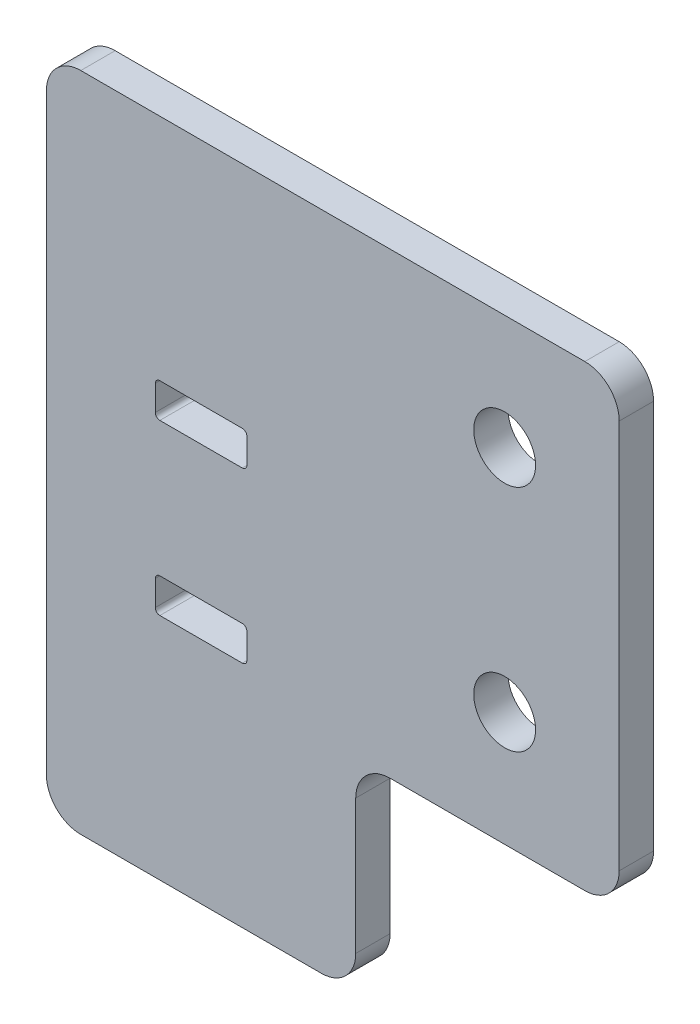
ISO-10303-21;
HEADER;
FILE_DESCRIPTION(('STEP AP214'),'2;1');
FILE_NAME('part.step','',(''),(''),'','','');
FILE_SCHEMA(('AUTOMOTIVE_DESIGN { 1 0 10303 214 1 1 1 1 }'));
ENDSEC;
DATA;
#1=APPLICATION_CONTEXT('core data for automotive mechanical design processes');
#2=APPLICATION_PROTOCOL_DEFINITION('international standard','automotive_design',2000,#1);
#3=PRODUCT_CONTEXT('',#1,'mechanical');
#4=PRODUCT('Part','Part','',(#3));
#5=PRODUCT_RELATED_PRODUCT_CATEGORY('part','',(#4));
#6=PRODUCT_DEFINITION_FORMATION('','',#4);
#7=PRODUCT_DEFINITION_CONTEXT('part definition',#1,'design');
#8=PRODUCT_DEFINITION('design','',#6,#7);
#9=PRODUCT_DEFINITION_SHAPE('','',#8);
#10=(LENGTH_UNIT() NAMED_UNIT(*) SI_UNIT(.MILLI.,.METRE.));
#11=(NAMED_UNIT(*) PLANE_ANGLE_UNIT() SI_UNIT($,.RADIAN.));
#12=(NAMED_UNIT(*) SI_UNIT($,.STERADIAN.) SOLID_ANGLE_UNIT());
#13=UNCERTAINTY_MEASURE_WITH_UNIT(LENGTH_MEASURE(1.E-05),#10,'distance_accuracy_value','');
#14=(GEOMETRIC_REPRESENTATION_CONTEXT(3) GLOBAL_UNCERTAINTY_ASSIGNED_CONTEXT((#13)) GLOBAL_UNIT_ASSIGNED_CONTEXT((#10,
#11,#12)) REPRESENTATION_CONTEXT('',''));
#15=CARTESIAN_POINT('',(0.,0.,0.));
#16=DIRECTION('',(0.,0.,1.));
#17=DIRECTION('',(1.,0.,0.));
#18=AXIS2_PLACEMENT_3D('',#15,#16,#17);
#19=CARTESIAN_POINT('',(47.,54.75,3.));
#20=DIRECTION('',(0.,0.,1.));
#21=DIRECTION('',(1.,0.,0.));
#22=AXIS2_PLACEMENT_3D('',#19,#20,#21);
#23=PLANE('',#22);
#24=DIRECTION('',(1.,0.,0.));
#25=VECTOR('',#24,1.);
#26=CARTESIAN_POINT('',(17.1,34.75,3.));
#27=LINE('',#26,#25);
#28=CARTESIAN_POINT('',(9.9,34.75,3.));
#29=VERTEX_POINT('',#28);
#30=CARTESIAN_POINT('',(17.1,34.75,3.));
#31=VERTEX_POINT('',#30);
#32=EDGE_CURVE('E285',#29,#31,#27,.T.);
#33=ORIENTED_EDGE('',*,*,#32,.F.);
#34=CARTESIAN_POINT('',(9.9,35.15,3.));
#35=DIRECTION('',(0.,0.,1.));
#36=DIRECTION('',(1.,0.,0.));
#37=AXIS2_PLACEMENT_3D('',#34,#35,#36);
#38=CIRCLE('',#37,0.399999999999998);
#39=CARTESIAN_POINT('',(9.5,35.15,3.));
#40=VERTEX_POINT('',#39);
#41=EDGE_CURVE('E283',#40,#29,#38,.T.);
#42=ORIENTED_EDGE('',*,*,#41,.F.);
#43=DIRECTION('',(0.,-1.,0.));
#44=VECTOR('',#43,1.);
#45=CARTESIAN_POINT('',(9.5,35.15,3.));
#46=LINE('',#45,#44);
#47=CARTESIAN_POINT('',(9.5,37.35,3.));
#48=VERTEX_POINT('',#47);
#49=EDGE_CURVE('E299',#48,#40,#46,.T.);
#50=ORIENTED_EDGE('',*,*,#49,.F.);
#51=CARTESIAN_POINT('',(9.9,37.35,3.));
#52=DIRECTION('',(0.,0.,1.));
#53=DIRECTION('',(1.,0.,0.));
#54=AXIS2_PLACEMENT_3D('',#51,#52,#53);
#55=CIRCLE('',#54,0.399999999999998);
#56=CARTESIAN_POINT('',(9.9,37.75,3.));
#57=VERTEX_POINT('',#56);
#58=EDGE_CURVE('E296',#57,#48,#55,.T.);
#59=ORIENTED_EDGE('',*,*,#58,.F.);
#60=DIRECTION('',(-1.,0.,0.));
#61=VECTOR('',#60,1.);
#62=CARTESIAN_POINT('',(9.9,37.75,3.));
#63=LINE('',#62,#61);
#64=CARTESIAN_POINT('',(17.1,37.75,3.));
#65=VERTEX_POINT('',#64);
#66=EDGE_CURVE('E294',#65,#57,#63,.T.);
#67=ORIENTED_EDGE('',*,*,#66,.F.);
#68=CARTESIAN_POINT('',(17.1,37.35,3.));
#69=DIRECTION('',(0.,0.,1.));
#70=DIRECTION('',(1.,0.,0.));
#71=AXIS2_PLACEMENT_3D('',#68,#69,#70);
#72=CIRCLE('',#71,0.399999999999998);
#73=CARTESIAN_POINT('',(17.5,37.35,3.));
#74=VERTEX_POINT('',#73);
#75=EDGE_CURVE('E292',#74,#65,#72,.T.);
#76=ORIENTED_EDGE('',*,*,#75,.F.);
#77=DIRECTION('',(0.,1.,0.));
#78=VECTOR('',#77,1.);
#79=CARTESIAN_POINT('',(17.5,37.35,3.));
#80=LINE('',#79,#78);
#81=CARTESIAN_POINT('',(17.5,35.15,3.));
#82=VERTEX_POINT('',#81);
#83=EDGE_CURVE('E290',#82,#74,#80,.T.);
#84=ORIENTED_EDGE('',*,*,#83,.F.);
#85=CARTESIAN_POINT('',(17.1,35.15,3.));
#86=DIRECTION('',(0.,0.,1.));
#87=DIRECTION('',(1.,0.,0.));
#88=AXIS2_PLACEMENT_3D('',#85,#86,#87);
#89=CIRCLE('',#88,0.399999999999999);
#90=EDGE_CURVE('E288',#31,#82,#89,.T.);
#91=ORIENTED_EDGE('',*,*,#90,.F.);
#92=EDGE_LOOP('',(#33,#42,#50,#59,#67,#76,#84,#91));
#93=FACE_BOUND('',#92,.T.);
#94=CARTESIAN_POINT('',(40.,27.75,3.));
#95=DIRECTION('',(0.,0.,1.));
#96=DIRECTION('',(1.,0.,0.));
#97=AXIS2_PLACEMENT_3D('',#94,#95,#96);
#98=CIRCLE('',#97,2.7);
#99=CARTESIAN_POINT('',(42.7,27.75,3.));
#100=VERTEX_POINT('',#99);
#101=EDGE_CURVE('E348',#100,#100,#98,.T.);
#102=ORIENTED_EDGE('',*,*,#101,.F.);
#103=EDGE_LOOP('',(#102));
#104=FACE_BOUND('',#103,.T.);
#105=CARTESIAN_POINT('',(47.,54.75,3.));
#106=DIRECTION('',(0.,0.,1.));
#107=DIRECTION('',(1.,0.,0.));
#108=AXIS2_PLACEMENT_3D('',#105,#106,#107);
#109=CIRCLE('',#108,3.);
#110=CARTESIAN_POINT('',(50.,54.75,3.));
#111=VERTEX_POINT('',#110);
#112=CARTESIAN_POINT('',(47.,57.75,3.));
#113=VERTEX_POINT('',#112);
#114=EDGE_CURVE('E354',#111,#113,#109,.T.);
#115=ORIENTED_EDGE('',*,*,#114,.T.);
#116=DIRECTION('',(-1.,0.,0.));
#117=VECTOR('',#116,1.);
#118=CARTESIAN_POINT('',(47.,57.75,3.));
#119=LINE('',#118,#117);
#120=CARTESIAN_POINT('',(3.,57.75,3.));
#121=VERTEX_POINT('',#120);
#122=EDGE_CURVE('E357',#113,#121,#119,.T.);
#123=ORIENTED_EDGE('',*,*,#122,.T.);
#124=CARTESIAN_POINT('',(3.00000000000001,54.75,3.));
#125=DIRECTION('',(0.,0.,1.));
#126=DIRECTION('',(1.,0.,0.));
#127=AXIS2_PLACEMENT_3D('',#124,#125,#126);
#128=CIRCLE('',#127,3.);
#129=CARTESIAN_POINT('',(0.,54.75,3.));
#130=VERTEX_POINT('',#129);
#131=EDGE_CURVE('E360',#121,#130,#128,.T.);
#132=ORIENTED_EDGE('',*,*,#131,.T.);
#133=DIRECTION('',(0.,-1.,0.));
#134=VECTOR('',#133,1.);
#135=CARTESIAN_POINT('',(0.,54.75,3.));
#136=LINE('',#135,#134);
#137=CARTESIAN_POINT('',(0.,3.,3.));
#138=VERTEX_POINT('',#137);
#139=EDGE_CURVE('E362',#130,#138,#136,.T.);
#140=ORIENTED_EDGE('',*,*,#139,.T.);
#141=CARTESIAN_POINT('',(3.,3.,3.));
#142=DIRECTION('',(0.,0.,1.));
#143=DIRECTION('',(1.,0.,0.));
#144=AXIS2_PLACEMENT_3D('',#141,#142,#143);
#145=CIRCLE('',#144,3.);
#146=CARTESIAN_POINT('',(3.,0.,3.));
#147=VERTEX_POINT('',#146);
#148=EDGE_CURVE('E364',#138,#147,#145,.T.);
#149=ORIENTED_EDGE('',*,*,#148,.T.);
#150=DIRECTION('',(1.,0.,0.));
#151=VECTOR('',#150,1.);
#152=CARTESIAN_POINT('',(3.,0.,3.));
#153=LINE('',#152,#151);
#154=CARTESIAN_POINT('',(24.,0.,3.));
#155=VERTEX_POINT('',#154);
#156=EDGE_CURVE('E366',#147,#155,#153,.T.);
#157=ORIENTED_EDGE('',*,*,#156,.T.);
#158=CARTESIAN_POINT('',(24.,3.,3.));
#159=DIRECTION('',(0.,0.,1.));
#160=DIRECTION('',(1.,0.,0.));
#161=AXIS2_PLACEMENT_3D('',#158,#159,#160);
#162=CIRCLE('',#161,3.);
#163=CARTESIAN_POINT('',(27.,3.,3.));
#164=VERTEX_POINT('',#163);
#165=EDGE_CURVE('E368',#155,#164,#162,.T.);
#166=ORIENTED_EDGE('',*,*,#165,.T.);
#167=DIRECTION('',(0.,1.,0.));
#168=VECTOR('',#167,1.);
#169=CARTESIAN_POINT('',(27.,3.,3.));
#170=LINE('',#169,#168);
#171=CARTESIAN_POINT('',(27.,14.75,3.));
#172=VERTEX_POINT('',#171);
#173=EDGE_CURVE('E370',#164,#172,#170,.T.);
#174=ORIENTED_EDGE('',*,*,#173,.T.);
#175=CARTESIAN_POINT('',(30.,14.75,3.));
#176=DIRECTION('',(0.,0.,-1.));
#177=DIRECTION('',(1.,0.,0.));
#178=AXIS2_PLACEMENT_3D('',#175,#176,#177);
#179=CIRCLE('',#178,3.);
#180=CARTESIAN_POINT('',(30.,17.75,3.));
#181=VERTEX_POINT('',#180);
#182=EDGE_CURVE('E372',#172,#181,#179,.T.);
#183=ORIENTED_EDGE('',*,*,#182,.T.);
#184=DIRECTION('',(1.,0.,0.));
#185=VECTOR('',#184,1.);
#186=CARTESIAN_POINT('',(30.,17.75,3.));
#187=LINE('',#186,#185);
#188=CARTESIAN_POINT('',(47.,17.75,3.));
#189=VERTEX_POINT('',#188);
#190=EDGE_CURVE('E374',#181,#189,#187,.T.);
#191=ORIENTED_EDGE('',*,*,#190,.T.);
#192=CARTESIAN_POINT('',(47.,20.75,3.));
#193=DIRECTION('',(0.,0.,1.));
#194=DIRECTION('',(1.,0.,0.));
#195=AXIS2_PLACEMENT_3D('',#192,#193,#194);
#196=CIRCLE('',#195,3.);
#197=CARTESIAN_POINT('',(50.,20.75,3.));
#198=VERTEX_POINT('',#197);
#199=EDGE_CURVE('E376',#189,#198,#196,.T.);
#200=ORIENTED_EDGE('',*,*,#199,.T.);
#201=DIRECTION('',(0.,1.,0.));
#202=VECTOR('',#201,1.);
#203=CARTESIAN_POINT('',(50.,20.75,3.));
#204=LINE('',#203,#202);
#205=EDGE_CURVE('E378',#198,#111,#204,.T.);
#206=ORIENTED_EDGE('',*,*,#205,.T.);
#207=EDGE_LOOP('',(#115,#123,#132,#140,#149,#157,#166,#174,#183,#191,#200,#206));
#208=FACE_BOUND('',#207,.T.);
#209=CARTESIAN_POINT('',(40.,47.75,3.));
#210=DIRECTION('',(0.,0.,1.));
#211=DIRECTION('',(1.,0.,0.));
#212=AXIS2_PLACEMENT_3D('',#209,#210,#211);
#213=CIRCLE('',#212,2.7);
#214=CARTESIAN_POINT('',(42.7,47.75,3.));
#215=VERTEX_POINT('',#214);
#216=EDGE_CURVE('E342',#215,#215,#213,.T.);
#217=ORIENTED_EDGE('',*,*,#216,.F.);
#218=EDGE_LOOP('',(#217));
#219=FACE_BOUND('',#218,.T.);
#220=DIRECTION('',(1.,0.,0.));
#221=VECTOR('',#220,1.);
#222=CARTESIAN_POINT('',(17.1000000277287,20.0000001038905,3.));
#223=LINE('',#222,#221);
#224=CARTESIAN_POINT('',(9.90000002772867,20.0000001038905,3.));
#225=VERTEX_POINT('',#224);
#226=CARTESIAN_POINT('',(17.1000000277287,20.0000001038905,3.));
#227=VERTEX_POINT('',#226);
#228=EDGE_CURVE('E226',#225,#227,#223,.T.);
#229=ORIENTED_EDGE('',*,*,#228,.F.);
#230=CARTESIAN_POINT('',(9.90000002772867,20.4000001038905,3.));
#231=DIRECTION('',(0.,0.,1.));
#232=DIRECTION('',(1.,0.,0.));
#233=AXIS2_PLACEMENT_3D('',#230,#231,#232);
#234=CIRCLE('',#233,0.399999999999998);
#235=CARTESIAN_POINT('',(9.50000002772867,20.4000001038905,3.));
#236=VERTEX_POINT('',#235);
#237=EDGE_CURVE('E218',#236,#225,#234,.T.);
#238=ORIENTED_EDGE('',*,*,#237,.F.);
#239=DIRECTION('',(0.,-1.,0.));
#240=VECTOR('',#239,1.);
#241=CARTESIAN_POINT('',(9.50000002772867,20.4000001038905,3.));
#242=LINE('',#241,#240);
#243=CARTESIAN_POINT('',(9.50000002772867,22.6000001038905,3.));
#244=VERTEX_POINT('',#243);
#245=EDGE_CURVE('E251',#244,#236,#242,.T.);
#246=ORIENTED_EDGE('',*,*,#245,.F.);
#247=CARTESIAN_POINT('',(9.90000002772867,22.6000001038905,3.));
#248=DIRECTION('',(0.,0.,1.));
#249=DIRECTION('',(1.,0.,0.));
#250=AXIS2_PLACEMENT_3D('',#247,#248,#249);
#251=CIRCLE('',#250,0.399999999999998);
#252=CARTESIAN_POINT('',(9.90000002772867,23.0000001038905,3.));
#253=VERTEX_POINT('',#252);
#254=EDGE_CURVE('E249',#253,#244,#251,.T.);
#255=ORIENTED_EDGE('',*,*,#254,.F.);
#256=DIRECTION('',(-1.,0.,0.));
#257=VECTOR('',#256,1.);
#258=CARTESIAN_POINT('',(9.90000002772867,23.0000001038905,3.));
#259=LINE('',#258,#257);
#260=CARTESIAN_POINT('',(17.1000000277287,23.0000001038905,3.));
#261=VERTEX_POINT('',#260);
#262=EDGE_CURVE('E247',#261,#253,#259,.T.);
#263=ORIENTED_EDGE('',*,*,#262,.F.);
#264=CARTESIAN_POINT('',(17.1000000277287,22.6000001038905,3.));
#265=DIRECTION('',(0.,0.,1.));
#266=DIRECTION('',(1.,0.,0.));
#267=AXIS2_PLACEMENT_3D('',#264,#265,#266);
#268=CIRCLE('',#267,0.399999999999998);
#269=CARTESIAN_POINT('',(17.5000000277287,22.6000001038905,3.));
#270=VERTEX_POINT('',#269);
#271=EDGE_CURVE('E245',#270,#261,#268,.T.);
#272=ORIENTED_EDGE('',*,*,#271,.F.);
#273=DIRECTION('',(0.,1.,0.));
#274=VECTOR('',#273,1.);
#275=CARTESIAN_POINT('',(17.5000000277287,22.6000001038905,3.));
#276=LINE('',#275,#274);
#277=CARTESIAN_POINT('',(17.5000000277287,20.4000001038905,3.));
#278=VERTEX_POINT('',#277);
#279=EDGE_CURVE('E241',#278,#270,#276,.T.);
#280=ORIENTED_EDGE('',*,*,#279,.F.);
#281=CARTESIAN_POINT('',(17.1000000277287,20.4000001038905,3.));
#282=DIRECTION('',(0.,0.,1.));
#283=DIRECTION('',(1.,0.,0.));
#284=AXIS2_PLACEMENT_3D('',#281,#282,#283);
#285=CIRCLE('',#284,0.399999999999998);
#286=EDGE_CURVE('E239',#227,#278,#285,.T.);
#287=ORIENTED_EDGE('',*,*,#286,.F.);
#288=EDGE_LOOP('',(#229,#238,#246,#255,#263,#272,#280,#287));
#289=FACE_BOUND('',#288,.T.);
#290=ADVANCED_FACE('F33',(#93,#104,#208,#219,#289),#23,.T.);
#291=CARTESIAN_POINT('',(47.,54.75,0.));
#292=DIRECTION('',(0.,0.,1.));
#293=DIRECTION('',(1.,0.,0.));
#294=AXIS2_PLACEMENT_3D('',#291,#292,#293);
#295=PLANE('',#294);
#296=CARTESIAN_POINT('',(9.9,35.15,0.));
#297=DIRECTION('',(0.,0.,1.));
#298=DIRECTION('',(1.,0.,0.));
#299=AXIS2_PLACEMENT_3D('',#296,#297,#298);
#300=CIRCLE('',#299,0.399999999999998);
#301=CARTESIAN_POINT('',(9.5,35.15,0.));
#302=VERTEX_POINT('',#301);
#303=CARTESIAN_POINT('',(9.9,34.75,0.));
#304=VERTEX_POINT('',#303);
#305=EDGE_CURVE('E234',#302,#304,#300,.T.);
#306=ORIENTED_EDGE('',*,*,#305,.T.);
#307=DIRECTION('',(1.,0.,0.));
#308=VECTOR('',#307,1.);
#309=CARTESIAN_POINT('',(17.1,34.75,0.));
#310=LINE('',#309,#308);
#311=CARTESIAN_POINT('',(17.1,34.75,0.));
#312=VERTEX_POINT('',#311);
#313=EDGE_CURVE('E304',#304,#312,#310,.T.);
#314=ORIENTED_EDGE('',*,*,#313,.T.);
#315=CARTESIAN_POINT('',(17.1,35.15,0.));
#316=DIRECTION('',(0.,0.,1.));
#317=DIRECTION('',(1.,0.,0.));
#318=AXIS2_PLACEMENT_3D('',#315,#316,#317);
#319=CIRCLE('',#318,0.399999999999999);
#320=CARTESIAN_POINT('',(17.5,35.15,0.));
#321=VERTEX_POINT('',#320);
#322=EDGE_CURVE('E307',#312,#321,#319,.T.);
#323=ORIENTED_EDGE('',*,*,#322,.T.);
#324=DIRECTION('',(0.,1.,0.));
#325=VECTOR('',#324,1.);
#326=CARTESIAN_POINT('',(17.5,37.35,0.));
#327=LINE('',#326,#325);
#328=CARTESIAN_POINT('',(17.5,37.35,0.));
#329=VERTEX_POINT('',#328);
#330=EDGE_CURVE('E310',#321,#329,#327,.T.);
#331=ORIENTED_EDGE('',*,*,#330,.T.);
#332=CARTESIAN_POINT('',(17.1,37.35,0.));
#333=DIRECTION('',(0.,0.,1.));
#334=DIRECTION('',(1.,0.,0.));
#335=AXIS2_PLACEMENT_3D('',#332,#333,#334);
#336=CIRCLE('',#335,0.399999999999998);
#337=CARTESIAN_POINT('',(17.1,37.75,0.));
#338=VERTEX_POINT('',#337);
#339=EDGE_CURVE('E313',#329,#338,#336,.T.);
#340=ORIENTED_EDGE('',*,*,#339,.T.);
#341=DIRECTION('',(-1.,0.,0.));
#342=VECTOR('',#341,1.);
#343=CARTESIAN_POINT('',(9.9,37.75,0.));
#344=LINE('',#343,#342);
#345=CARTESIAN_POINT('',(9.9,37.75,0.));
#346=VERTEX_POINT('',#345);
#347=EDGE_CURVE('E316',#338,#346,#344,.T.);
#348=ORIENTED_EDGE('',*,*,#347,.T.);
#349=CARTESIAN_POINT('',(9.9,37.35,0.));
#350=DIRECTION('',(0.,0.,1.));
#351=DIRECTION('',(1.,0.,0.));
#352=AXIS2_PLACEMENT_3D('',#349,#350,#351);
#353=CIRCLE('',#352,0.399999999999998);
#354=CARTESIAN_POINT('',(9.5,37.35,0.));
#355=VERTEX_POINT('',#354);
#356=EDGE_CURVE('E319',#346,#355,#353,.T.);
#357=ORIENTED_EDGE('',*,*,#356,.T.);
#358=DIRECTION('',(0.,-1.,0.));
#359=VECTOR('',#358,1.);
#360=CARTESIAN_POINT('',(9.5,35.15,0.));
#361=LINE('',#360,#359);
#362=EDGE_CURVE('E286',#355,#302,#361,.T.);
#363=ORIENTED_EDGE('',*,*,#362,.T.);
#364=EDGE_LOOP('',(#306,#314,#323,#331,#340,#348,#357,#363));
#365=FACE_BOUND('',#364,.T.);
#366=CARTESIAN_POINT('',(40.,27.75,0.));
#367=DIRECTION('',(0.,0.,1.));
#368=DIRECTION('',(1.,0.,0.));
#369=AXIS2_PLACEMENT_3D('',#366,#367,#368);
#370=CIRCLE('',#369,2.7);
#371=CARTESIAN_POINT('',(42.7,27.75,0.));
#372=VERTEX_POINT('',#371);
#373=EDGE_CURVE('E345',#372,#372,#370,.T.);
#374=ORIENTED_EDGE('',*,*,#373,.T.);
#375=EDGE_LOOP('',(#374));
#376=FACE_BOUND('',#375,.T.);
#377=CARTESIAN_POINT('',(47.,54.75,0.));
#378=DIRECTION('',(0.,0.,1.));
#379=DIRECTION('',(1.,0.,0.));
#380=AXIS2_PLACEMENT_3D('',#377,#378,#379);
#381=CIRCLE('',#380,3.);
#382=CARTESIAN_POINT('',(50.,54.75,0.));
#383=VERTEX_POINT('',#382);
#384=CARTESIAN_POINT('',(47.,57.75,0.));
#385=VERTEX_POINT('',#384);
#386=EDGE_CURVE('E351',#383,#385,#381,.T.);
#387=ORIENTED_EDGE('',*,*,#386,.F.);
#388=DIRECTION('',(0.,1.,0.));
#389=VECTOR('',#388,1.);
#390=CARTESIAN_POINT('',(50.,20.75,0.));
#391=LINE('',#390,#389);
#392=CARTESIAN_POINT('',(50.,20.75,0.));
#393=VERTEX_POINT('',#392);
#394=EDGE_CURVE('E358',#393,#383,#391,.T.);
#395=ORIENTED_EDGE('',*,*,#394,.F.);
#396=CARTESIAN_POINT('',(47.,20.75,0.));
#397=DIRECTION('',(0.,0.,1.));
#398=DIRECTION('',(1.,0.,0.));
#399=AXIS2_PLACEMENT_3D('',#396,#397,#398);
#400=CIRCLE('',#399,3.);
#401=CARTESIAN_POINT('',(47.,17.75,0.));
#402=VERTEX_POINT('',#401);
#403=EDGE_CURVE('E401',#402,#393,#400,.T.);
#404=ORIENTED_EDGE('',*,*,#403,.F.);
#405=DIRECTION('',(1.,0.,0.));
#406=VECTOR('',#405,1.);
#407=CARTESIAN_POINT('',(30.,17.75,0.));
#408=LINE('',#407,#406);
#409=CARTESIAN_POINT('',(30.,17.75,0.));
#410=VERTEX_POINT('',#409);
#411=EDGE_CURVE('E399',#410,#402,#408,.T.);
#412=ORIENTED_EDGE('',*,*,#411,.F.);
#413=CARTESIAN_POINT('',(30.,14.75,0.));
#414=DIRECTION('',(0.,0.,-1.));
#415=DIRECTION('',(1.,0.,0.));
#416=AXIS2_PLACEMENT_3D('',#413,#414,#415);
#417=CIRCLE('',#416,3.);
#418=CARTESIAN_POINT('',(27.,14.75,0.));
#419=VERTEX_POINT('',#418);
#420=EDGE_CURVE('E397',#419,#410,#417,.T.);
#421=ORIENTED_EDGE('',*,*,#420,.F.);
#422=DIRECTION('',(0.,1.,0.));
#423=VECTOR('',#422,1.);
#424=CARTESIAN_POINT('',(27.,3.,0.));
#425=LINE('',#424,#423);
#426=CARTESIAN_POINT('',(27.,3.,0.));
#427=VERTEX_POINT('',#426);
#428=EDGE_CURVE('E395',#427,#419,#425,.T.);
#429=ORIENTED_EDGE('',*,*,#428,.F.);
#430=CARTESIAN_POINT('',(24.,3.,0.));
#431=DIRECTION('',(0.,0.,1.));
#432=DIRECTION('',(1.,0.,0.));
#433=AXIS2_PLACEMENT_3D('',#430,#431,#432);
#434=CIRCLE('',#433,3.);
#435=CARTESIAN_POINT('',(24.,0.,0.));
#436=VERTEX_POINT('',#435);
#437=EDGE_CURVE('E393',#436,#427,#434,.T.);
#438=ORIENTED_EDGE('',*,*,#437,.F.);
#439=DIRECTION('',(1.,0.,0.));
#440=VECTOR('',#439,1.);
#441=CARTESIAN_POINT('',(3.,0.,0.));
#442=LINE('',#441,#440);
#443=CARTESIAN_POINT('',(3.,0.,0.));
#444=VERTEX_POINT('',#443);
#445=EDGE_CURVE('E391',#444,#436,#442,.T.);
#446=ORIENTED_EDGE('',*,*,#445,.F.);
#447=CARTESIAN_POINT('',(3.,3.,0.));
#448=DIRECTION('',(0.,0.,1.));
#449=DIRECTION('',(1.,0.,0.));
#450=AXIS2_PLACEMENT_3D('',#447,#448,#449);
#451=CIRCLE('',#450,3.);
#452=CARTESIAN_POINT('',(0.,3.,0.));
#453=VERTEX_POINT('',#452);
#454=EDGE_CURVE('E389',#453,#444,#451,.T.);
#455=ORIENTED_EDGE('',*,*,#454,.F.);
#456=DIRECTION('',(0.,-1.,0.));
#457=VECTOR('',#456,1.);
#458=CARTESIAN_POINT('',(0.,54.75,0.));
#459=LINE('',#458,#457);
#460=CARTESIAN_POINT('',(0.,54.75,0.));
#461=VERTEX_POINT('',#460);
#462=EDGE_CURVE('E387',#461,#453,#459,.T.);
#463=ORIENTED_EDGE('',*,*,#462,.F.);
#464=CARTESIAN_POINT('',(3.00000000000001,54.75,0.));
#465=DIRECTION('',(0.,0.,1.));
#466=DIRECTION('',(1.,0.,0.));
#467=AXIS2_PLACEMENT_3D('',#464,#465,#466);
#468=CIRCLE('',#467,3.);
#469=CARTESIAN_POINT('',(3.,57.75,0.));
#470=VERTEX_POINT('',#469);
#471=EDGE_CURVE('E385',#470,#461,#468,.T.);
#472=ORIENTED_EDGE('',*,*,#471,.F.);
#473=DIRECTION('',(-1.,0.,0.));
#474=VECTOR('',#473,1.);
#475=CARTESIAN_POINT('',(47.,57.75,0.));
#476=LINE('',#475,#474);
#477=EDGE_CURVE('E383',#385,#470,#476,.T.);
#478=ORIENTED_EDGE('',*,*,#477,.F.);
#479=EDGE_LOOP('',(#387,#395,#404,#412,#421,#429,#438,#446,#455,#463,#472,#478));
#480=FACE_BOUND('',#479,.T.);
#481=CARTESIAN_POINT('',(40.,47.75,0.));
#482=DIRECTION('',(0.,0.,1.));
#483=DIRECTION('',(1.,0.,0.));
#484=AXIS2_PLACEMENT_3D('',#481,#482,#483);
#485=CIRCLE('',#484,2.7);
#486=CARTESIAN_POINT('',(42.7,47.75,0.));
#487=VERTEX_POINT('',#486);
#488=EDGE_CURVE('E341',#487,#487,#485,.T.);
#489=ORIENTED_EDGE('',*,*,#488,.T.);
#490=EDGE_LOOP('',(#489));
#491=FACE_BOUND('',#490,.T.);
#492=CARTESIAN_POINT('',(9.90000002772867,20.4000001038905,0.));
#493=DIRECTION('',(0.,0.,1.));
#494=DIRECTION('',(1.,0.,0.));
#495=AXIS2_PLACEMENT_3D('',#492,#493,#494);
#496=CIRCLE('',#495,0.399999999999998);
#497=CARTESIAN_POINT('',(9.50000002772867,20.4000001038905,0.));
#498=VERTEX_POINT('',#497);
#499=CARTESIAN_POINT('',(9.90000002772867,20.0000001038905,0.));
#500=VERTEX_POINT('',#499);
#501=EDGE_CURVE('E56',#498,#500,#496,.T.);
#502=ORIENTED_EDGE('',*,*,#501,.T.);
#503=DIRECTION('',(1.,0.,0.));
#504=VECTOR('',#503,1.);
#505=CARTESIAN_POINT('',(17.1000000277287,20.0000001038905,0.));
#506=LINE('',#505,#504);
#507=CARTESIAN_POINT('',(17.1000000277287,20.0000001038905,0.));
#508=VERTEX_POINT('',#507);
#509=EDGE_CURVE('E233',#500,#508,#506,.T.);
#510=ORIENTED_EDGE('',*,*,#509,.T.);
#511=CARTESIAN_POINT('',(17.1000000277287,20.4000001038905,0.));
#512=DIRECTION('',(0.,0.,1.));
#513=DIRECTION('',(1.,0.,0.));
#514=AXIS2_PLACEMENT_3D('',#511,#512,#513);
#515=CIRCLE('',#514,0.399999999999998);
#516=CARTESIAN_POINT('',(17.5000000277287,20.4000001038905,0.));
#517=VERTEX_POINT('',#516);
#518=EDGE_CURVE('E255',#508,#517,#515,.T.);
#519=ORIENTED_EDGE('',*,*,#518,.T.);
#520=DIRECTION('',(0.,1.,0.));
#521=VECTOR('',#520,1.);
#522=CARTESIAN_POINT('',(17.5000000277287,22.6000001038905,0.));
#523=LINE('',#522,#521);
#524=CARTESIAN_POINT('',(17.5000000277287,22.6000001038905,0.));
#525=VERTEX_POINT('',#524);
#526=EDGE_CURVE('E258',#517,#525,#523,.T.);
#527=ORIENTED_EDGE('',*,*,#526,.T.);
#528=CARTESIAN_POINT('',(17.1000000277287,22.6000001038905,0.));
#529=DIRECTION('',(0.,0.,1.));
#530=DIRECTION('',(1.,0.,0.));
#531=AXIS2_PLACEMENT_3D('',#528,#529,#530);
#532=CIRCLE('',#531,0.399999999999998);
#533=CARTESIAN_POINT('',(17.1000000277287,23.0000001038905,0.));
#534=VERTEX_POINT('',#533);
#535=EDGE_CURVE('E261',#525,#534,#532,.T.);
#536=ORIENTED_EDGE('',*,*,#535,.T.);
#537=DIRECTION('',(-1.,0.,0.));
#538=VECTOR('',#537,1.);
#539=CARTESIAN_POINT('',(9.90000002772867,23.0000001038905,0.));
#540=LINE('',#539,#538);
#541=CARTESIAN_POINT('',(9.90000002772867,23.0000001038905,0.));
#542=VERTEX_POINT('',#541);
#543=EDGE_CURVE('E264',#534,#542,#540,.T.);
#544=ORIENTED_EDGE('',*,*,#543,.T.);
#545=CARTESIAN_POINT('',(9.90000002772867,22.6000001038905,0.));
#546=DIRECTION('',(0.,0.,1.));
#547=DIRECTION('',(1.,0.,0.));
#548=AXIS2_PLACEMENT_3D('',#545,#546,#547);
#549=CIRCLE('',#548,0.399999999999998);
#550=CARTESIAN_POINT('',(9.50000002772867,22.6000001038905,0.));
#551=VERTEX_POINT('',#550);
#552=EDGE_CURVE('E267',#542,#551,#549,.T.);
#553=ORIENTED_EDGE('',*,*,#552,.T.);
#554=DIRECTION('',(0.,-1.,0.));
#555=VECTOR('',#554,1.);
#556=CARTESIAN_POINT('',(9.50000002772867,20.4000001038905,0.));
#557=LINE('',#556,#555);
#558=EDGE_CURVE('E227',#551,#498,#557,.T.);
#559=ORIENTED_EDGE('',*,*,#558,.T.);
#560=EDGE_LOOP('',(#502,#510,#519,#527,#536,#544,#553,#559));
#561=FACE_BOUND('',#560,.T.);
#562=ADVANCED_FACE('F443',(#365,#376,#480,#491,#561),#295,.F.);
#563=CARTESIAN_POINT('',(47.,54.75,3.));
#564=DIRECTION('',(0.,0.,-1.));
#565=DIRECTION('',(-1.,0.,0.));
#566=AXIS2_PLACEMENT_3D('',#563,#564,#565);
#567=CYLINDRICAL_SURFACE('',#566,3.);
#568=ORIENTED_EDGE('',*,*,#386,.T.);
#569=DIRECTION('',(0.,0.,-1.));
#570=VECTOR('',#569,1.);
#571=CARTESIAN_POINT('',(47.,57.75,3.));
#572=LINE('',#571,#570);
#573=EDGE_CURVE('E11',#113,#385,#572,.T.);
#574=ORIENTED_EDGE('',*,*,#573,.F.);
#575=ORIENTED_EDGE('',*,*,#114,.F.);
#576=DIRECTION('',(0.,0.,-1.));
#577=VECTOR('',#576,1.);
#578=CARTESIAN_POINT('',(50.,54.75,3.));
#579=LINE('',#578,#577);
#580=EDGE_CURVE('E380',#111,#383,#579,.T.);
#581=ORIENTED_EDGE('',*,*,#580,.T.);
#582=EDGE_LOOP('',(#568,#574,#575,#581));
#583=FACE_BOUND('',#582,.T.);
#584=ADVANCED_FACE('F35',(#583),#567,.T.);
#585=CARTESIAN_POINT('',(47.,57.75,3.));
#586=DIRECTION('',(0.,-1.,0.));
#587=DIRECTION('',(1.,0.,0.));
#588=AXIS2_PLACEMENT_3D('',#585,#586,#587);
#589=PLANE('',#588);
#590=ORIENTED_EDGE('',*,*,#477,.T.);
#591=DIRECTION('',(0.,0.,-1.));
#592=VECTOR('',#591,1.);
#593=CARTESIAN_POINT('',(3.,57.75,3.));
#594=LINE('',#593,#592);
#595=EDGE_CURVE('E41',#121,#470,#594,.T.);
#596=ORIENTED_EDGE('',*,*,#595,.F.);
#597=ORIENTED_EDGE('',*,*,#122,.F.);
#598=ORIENTED_EDGE('',*,*,#573,.T.);
#599=EDGE_LOOP('',(#590,#596,#597,#598));
#600=FACE_BOUND('',#599,.T.);
#601=ADVANCED_FACE('F461',(#600),#589,.F.);
#602=CARTESIAN_POINT('',(3.00000000000001,54.75,3.));
#603=DIRECTION('',(0.,0.,-1.));
#604=DIRECTION('',(-1.,0.,0.));
#605=AXIS2_PLACEMENT_3D('',#602,#603,#604);
#606=CYLINDRICAL_SURFACE('',#605,3.);
#607=ORIENTED_EDGE('',*,*,#471,.T.);
#608=DIRECTION('',(0.,0.,-1.));
#609=VECTOR('',#608,1.);
#610=CARTESIAN_POINT('',(0.,54.75,3.));
#611=LINE('',#610,#609);
#612=EDGE_CURVE('E430',#130,#461,#611,.T.);
#613=ORIENTED_EDGE('',*,*,#612,.F.);
#614=ORIENTED_EDGE('',*,*,#131,.F.);
#615=ORIENTED_EDGE('',*,*,#595,.T.);
#616=EDGE_LOOP('',(#607,#613,#614,#615));
#617=FACE_BOUND('',#616,.T.);
#618=ADVANCED_FACE('F437',(#617),#606,.T.);
#619=CARTESIAN_POINT('',(0.,54.75,3.));
#620=DIRECTION('',(1.,0.,0.));
#621=DIRECTION('',(0.,1.,0.));
#622=AXIS2_PLACEMENT_3D('',#619,#620,#621);
#623=PLANE('',#622);
#624=ORIENTED_EDGE('',*,*,#462,.T.);
#625=DIRECTION('',(0.,0.,-1.));
#626=VECTOR('',#625,1.);
#627=CARTESIAN_POINT('',(0.,3.,3.));
#628=LINE('',#627,#626);
#629=EDGE_CURVE('E427',#138,#453,#628,.T.);
#630=ORIENTED_EDGE('',*,*,#629,.F.);
#631=ORIENTED_EDGE('',*,*,#139,.F.);
#632=ORIENTED_EDGE('',*,*,#612,.T.);
#633=EDGE_LOOP('',(#624,#630,#631,#632));
#634=FACE_BOUND('',#633,.T.);
#635=ADVANCED_FACE('F449',(#634),#623,.F.);
#636=CARTESIAN_POINT('',(3.,3.,3.));
#637=DIRECTION('',(0.,0.,-1.));
#638=DIRECTION('',(-1.,0.,0.));
#639=AXIS2_PLACEMENT_3D('',#636,#637,#638);
#640=CYLINDRICAL_SURFACE('',#639,3.);
#641=ORIENTED_EDGE('',*,*,#454,.T.);
#642=DIRECTION('',(0.,0.,-1.));
#643=VECTOR('',#642,1.);
#644=CARTESIAN_POINT('',(3.,0.,3.));
#645=LINE('',#644,#643);
#646=EDGE_CURVE('E424',#147,#444,#645,.T.);
#647=ORIENTED_EDGE('',*,*,#646,.F.);
#648=ORIENTED_EDGE('',*,*,#148,.F.);
#649=ORIENTED_EDGE('',*,*,#629,.T.);
#650=EDGE_LOOP('',(#641,#647,#648,#649));
#651=FACE_BOUND('',#650,.T.);
#652=ADVANCED_FACE('F453',(#651),#640,.T.);
#653=CARTESIAN_POINT('',(3.,0.,3.));
#654=DIRECTION('',(0.,1.,0.));
#655=DIRECTION('',(0.,0.,1.));
#656=AXIS2_PLACEMENT_3D('',#653,#654,#655);
#657=PLANE('',#656);
#658=ORIENTED_EDGE('',*,*,#445,.T.);
#659=DIRECTION('',(0.,0.,-1.));
#660=VECTOR('',#659,1.);
#661=CARTESIAN_POINT('',(24.,0.,3.));
#662=LINE('',#661,#660);
#663=EDGE_CURVE('E421',#155,#436,#662,.T.);
#664=ORIENTED_EDGE('',*,*,#663,.F.);
#665=ORIENTED_EDGE('',*,*,#156,.F.);
#666=ORIENTED_EDGE('',*,*,#646,.T.);
#667=EDGE_LOOP('',(#658,#664,#665,#666));
#668=FACE_BOUND('',#667,.T.);
#669=ADVANCED_FACE('F494',(#668),#657,.F.);
#670=CARTESIAN_POINT('',(24.,3.,3.));
#671=DIRECTION('',(0.,0.,-1.));
#672=DIRECTION('',(-1.,0.,0.));
#673=AXIS2_PLACEMENT_3D('',#670,#671,#672);
#674=CYLINDRICAL_SURFACE('',#673,3.);
#675=ORIENTED_EDGE('',*,*,#437,.T.);
#676=DIRECTION('',(0.,0.,-1.));
#677=VECTOR('',#676,1.);
#678=CARTESIAN_POINT('',(27.,3.,3.));
#679=LINE('',#678,#677);
#680=EDGE_CURVE('E418',#164,#427,#679,.T.);
#681=ORIENTED_EDGE('',*,*,#680,.F.);
#682=ORIENTED_EDGE('',*,*,#165,.F.);
#683=ORIENTED_EDGE('',*,*,#663,.T.);
#684=EDGE_LOOP('',(#675,#681,#682,#683));
#685=FACE_BOUND('',#684,.T.);
#686=ADVANCED_FACE('F492',(#685),#674,.T.);
#687=CARTESIAN_POINT('',(27.,3.,3.));
#688=DIRECTION('',(-1.,0.,0.));
#689=DIRECTION('',(0.,0.,1.));
#690=AXIS2_PLACEMENT_3D('',#687,#688,#689);
#691=PLANE('',#690);
#692=ORIENTED_EDGE('',*,*,#428,.T.);
#693=DIRECTION('',(0.,0.,-1.));
#694=VECTOR('',#693,1.);
#695=CARTESIAN_POINT('',(27.,14.75,3.));
#696=LINE('',#695,#694);
#697=EDGE_CURVE('E415',#172,#419,#696,.T.);
#698=ORIENTED_EDGE('',*,*,#697,.F.);
#699=ORIENTED_EDGE('',*,*,#173,.F.);
#700=ORIENTED_EDGE('',*,*,#680,.T.);
#701=EDGE_LOOP('',(#692,#698,#699,#700));
#702=FACE_BOUND('',#701,.T.);
#703=ADVANCED_FACE('F488',(#702),#691,.F.);
#704=CARTESIAN_POINT('',(30.,14.75,3.));
#705=DIRECTION('',(0.,0.,-1.));
#706=DIRECTION('',(-1.,0.,0.));
#707=AXIS2_PLACEMENT_3D('',#704,#705,#706);
#708=CYLINDRICAL_SURFACE('',#707,3.);
#709=ORIENTED_EDGE('',*,*,#420,.T.);
#710=DIRECTION('',(0.,0.,-1.));
#711=VECTOR('',#710,1.);
#712=CARTESIAN_POINT('',(30.,17.75,3.));
#713=LINE('',#712,#711);
#714=EDGE_CURVE('E412',#181,#410,#713,.T.);
#715=ORIENTED_EDGE('',*,*,#714,.F.);
#716=ORIENTED_EDGE('',*,*,#182,.F.);
#717=ORIENTED_EDGE('',*,*,#697,.T.);
#718=EDGE_LOOP('',(#709,#715,#716,#717));
#719=FACE_BOUND('',#718,.T.);
#720=ADVANCED_FACE('F483',(#719),#708,.F.);
#721=CARTESIAN_POINT('',(30.,17.75,3.));
#722=DIRECTION('',(0.,1.,0.));
#723=DIRECTION('',(-1.,0.,0.));
#724=AXIS2_PLACEMENT_3D('',#721,#722,#723);
#725=PLANE('',#724);
#726=ORIENTED_EDGE('',*,*,#411,.T.);
#727=DIRECTION('',(0.,0.,-1.));
#728=VECTOR('',#727,1.);
#729=CARTESIAN_POINT('',(47.,17.75,3.));
#730=LINE('',#729,#728);
#731=EDGE_CURVE('E409',#189,#402,#730,.T.);
#732=ORIENTED_EDGE('',*,*,#731,.F.);
#733=ORIENTED_EDGE('',*,*,#190,.F.);
#734=ORIENTED_EDGE('',*,*,#714,.T.);
#735=EDGE_LOOP('',(#726,#732,#733,#734));
#736=FACE_BOUND('',#735,.T.);
#737=ADVANCED_FACE('F477',(#736),#725,.F.);
#738=CARTESIAN_POINT('',(47.,20.75,3.));
#739=DIRECTION('',(0.,0.,-1.));
#740=DIRECTION('',(-1.,0.,0.));
#741=AXIS2_PLACEMENT_3D('',#738,#739,#740);
#742=CYLINDRICAL_SURFACE('',#741,3.);
#743=ORIENTED_EDGE('',*,*,#403,.T.);
#744=DIRECTION('',(0.,0.,-1.));
#745=VECTOR('',#744,1.);
#746=CARTESIAN_POINT('',(50.,20.75,3.));
#747=LINE('',#746,#745);
#748=EDGE_CURVE('E406',#198,#393,#747,.T.);
#749=ORIENTED_EDGE('',*,*,#748,.F.);
#750=ORIENTED_EDGE('',*,*,#199,.F.);
#751=ORIENTED_EDGE('',*,*,#731,.T.);
#752=EDGE_LOOP('',(#743,#749,#750,#751));
#753=FACE_BOUND('',#752,.T.);
#754=ADVANCED_FACE('F473',(#753),#742,.T.);
#755=CARTESIAN_POINT('',(50.,20.75,3.));
#756=DIRECTION('',(-1.,0.,0.));
#757=DIRECTION('',(0.,0.,1.));
#758=AXIS2_PLACEMENT_3D('',#755,#756,#757);
#759=PLANE('',#758);
#760=ORIENTED_EDGE('',*,*,#394,.T.);
#761=ORIENTED_EDGE('',*,*,#580,.F.);
#762=ORIENTED_EDGE('',*,*,#205,.F.);
#763=ORIENTED_EDGE('',*,*,#748,.T.);
#764=EDGE_LOOP('',(#760,#761,#762,#763));
#765=FACE_BOUND('',#764,.T.);
#766=ADVANCED_FACE('F468',(#765),#759,.F.);
#767=CARTESIAN_POINT('',(40.,27.75,3.));
#768=DIRECTION('',(0.,0.,-1.));
#769=DIRECTION('',(-1.,0.,0.));
#770=AXIS2_PLACEMENT_3D('',#767,#768,#769);
#771=CYLINDRICAL_SURFACE('',#770,2.7);
#772=ORIENTED_EDGE('',*,*,#101,.T.);
#773=EDGE_LOOP('',(#772));
#774=FACE_BOUND('',#773,.T.);
#775=ORIENTED_EDGE('',*,*,#373,.F.);
#776=EDGE_LOOP('',(#775));
#777=FACE_BOUND('',#776,.T.);
#778=ADVANCED_FACE('F514',(#774,#777),#771,.F.);
#779=CARTESIAN_POINT('',(40.,47.75,3.));
#780=DIRECTION('',(0.,0.,-1.));
#781=DIRECTION('',(-1.,0.,0.));
#782=AXIS2_PLACEMENT_3D('',#779,#780,#781);
#783=CYLINDRICAL_SURFACE('',#782,2.7);
#784=ORIENTED_EDGE('',*,*,#216,.T.);
#785=EDGE_LOOP('',(#784));
#786=FACE_BOUND('',#785,.T.);
#787=ORIENTED_EDGE('',*,*,#488,.F.);
#788=EDGE_LOOP('',(#787));
#789=FACE_BOUND('',#788,.T.);
#790=ADVANCED_FACE('F552',(#786,#789),#783,.F.);
#791=CARTESIAN_POINT('',(9.9,35.15,3.));
#792=DIRECTION('',(0.,0.,-1.));
#793=DIRECTION('',(-1.,0.,0.));
#794=AXIS2_PLACEMENT_3D('',#791,#792,#793);
#795=CYLINDRICAL_SURFACE('',#794,0.399999999999998);
#796=ORIENTED_EDGE('',*,*,#305,.F.);
#797=DIRECTION('',(0.,0.,-1.));
#798=VECTOR('',#797,1.);
#799=CARTESIAN_POINT('',(9.5,35.15,3.));
#800=LINE('',#799,#798);
#801=EDGE_CURVE('E301',#40,#302,#800,.T.);
#802=ORIENTED_EDGE('',*,*,#801,.F.);
#803=ORIENTED_EDGE('',*,*,#41,.T.);
#804=DIRECTION('',(0.,0.,-1.));
#805=VECTOR('',#804,1.);
#806=CARTESIAN_POINT('',(9.9,34.75,3.));
#807=LINE('',#806,#805);
#808=EDGE_CURVE('E338',#29,#304,#807,.T.);
#809=ORIENTED_EDGE('',*,*,#808,.T.);
#810=EDGE_LOOP('',(#796,#802,#803,#809));
#811=FACE_BOUND('',#810,.T.);
#812=ADVANCED_FACE('F559',(#811),#795,.F.);
#813=CARTESIAN_POINT('',(17.1,34.75,3.));
#814=DIRECTION('',(0.,1.,0.));
#815=DIRECTION('',(0.,0.,1.));
#816=AXIS2_PLACEMENT_3D('',#813,#814,#815);
#817=PLANE('',#816);
#818=ORIENTED_EDGE('',*,*,#313,.F.);
#819=ORIENTED_EDGE('',*,*,#808,.F.);
#820=ORIENTED_EDGE('',*,*,#32,.T.);
#821=DIRECTION('',(0.,0.,-1.));
#822=VECTOR('',#821,1.);
#823=CARTESIAN_POINT('',(17.1,34.75,3.));
#824=LINE('',#823,#822);
#825=EDGE_CURVE('E336',#31,#312,#824,.T.);
#826=ORIENTED_EDGE('',*,*,#825,.T.);
#827=EDGE_LOOP('',(#818,#819,#820,#826));
#828=FACE_BOUND('',#827,.T.);
#829=ADVANCED_FACE('F566',(#828),#817,.T.);
#830=CARTESIAN_POINT('',(17.1,35.15,3.));
#831=DIRECTION('',(0.,0.,-1.));
#832=DIRECTION('',(-1.,0.,0.));
#833=AXIS2_PLACEMENT_3D('',#830,#831,#832);
#834=CYLINDRICAL_SURFACE('',#833,0.399999999999999);
#835=ORIENTED_EDGE('',*,*,#322,.F.);
#836=ORIENTED_EDGE('',*,*,#825,.F.);
#837=ORIENTED_EDGE('',*,*,#90,.T.);
#838=DIRECTION('',(0.,0.,-1.));
#839=VECTOR('',#838,1.);
#840=CARTESIAN_POINT('',(17.5,35.15,3.));
#841=LINE('',#840,#839);
#842=EDGE_CURVE('E334',#82,#321,#841,.T.);
#843=ORIENTED_EDGE('',*,*,#842,.T.);
#844=EDGE_LOOP('',(#835,#836,#837,#843));
#845=FACE_BOUND('',#844,.T.);
#846=ADVANCED_FACE('F574',(#845),#834,.F.);
#847=CARTESIAN_POINT('',(17.5,37.35,3.));
#848=DIRECTION('',(-1.,0.,0.));
#849=DIRECTION('',(0.,-1.,0.));
#850=AXIS2_PLACEMENT_3D('',#847,#848,#849);
#851=PLANE('',#850);
#852=ORIENTED_EDGE('',*,*,#330,.F.);
#853=ORIENTED_EDGE('',*,*,#842,.F.);
#854=ORIENTED_EDGE('',*,*,#83,.T.);
#855=DIRECTION('',(0.,0.,-1.));
#856=VECTOR('',#855,1.);
#857=CARTESIAN_POINT('',(17.5,37.35,3.));
#858=LINE('',#857,#856);
#859=EDGE_CURVE('E332',#74,#329,#858,.T.);
#860=ORIENTED_EDGE('',*,*,#859,.T.);
#861=EDGE_LOOP('',(#852,#853,#854,#860));
#862=FACE_BOUND('',#861,.T.);
#863=ADVANCED_FACE('F582',(#862),#851,.T.);
#864=CARTESIAN_POINT('',(17.1,37.35,3.));
#865=DIRECTION('',(0.,0.,-1.));
#866=DIRECTION('',(-1.,0.,0.));
#867=AXIS2_PLACEMENT_3D('',#864,#865,#866);
#868=CYLINDRICAL_SURFACE('',#867,0.399999999999998);
#869=ORIENTED_EDGE('',*,*,#339,.F.);
#870=ORIENTED_EDGE('',*,*,#859,.F.);
#871=ORIENTED_EDGE('',*,*,#75,.T.);
#872=DIRECTION('',(0.,0.,-1.));
#873=VECTOR('',#872,1.);
#874=CARTESIAN_POINT('',(17.1,37.75,3.));
#875=LINE('',#874,#873);
#876=EDGE_CURVE('E330',#65,#338,#875,.T.);
#877=ORIENTED_EDGE('',*,*,#876,.T.);
#878=EDGE_LOOP('',(#869,#870,#871,#877));
#879=FACE_BOUND('',#878,.T.);
#880=ADVANCED_FACE('F590',(#879),#868,.F.);
#881=CARTESIAN_POINT('',(9.9,37.75,3.));
#882=DIRECTION('',(0.,-1.,0.));
#883=DIRECTION('',(0.,0.,-1.));
#884=AXIS2_PLACEMENT_3D('',#881,#882,#883);
#885=PLANE('',#884);
#886=ORIENTED_EDGE('',*,*,#347,.F.);
#887=ORIENTED_EDGE('',*,*,#876,.F.);
#888=ORIENTED_EDGE('',*,*,#66,.T.);
#889=DIRECTION('',(0.,0.,-1.));
#890=VECTOR('',#889,1.);
#891=CARTESIAN_POINT('',(9.9,37.75,3.));
#892=LINE('',#891,#890);
#893=EDGE_CURVE('E328',#57,#346,#892,.T.);
#894=ORIENTED_EDGE('',*,*,#893,.T.);
#895=EDGE_LOOP('',(#886,#887,#888,#894));
#896=FACE_BOUND('',#895,.T.);
#897=ADVANCED_FACE('F598',(#896),#885,.T.);
#898=CARTESIAN_POINT('',(9.9,37.35,3.));
#899=DIRECTION('',(0.,0.,-1.));
#900=DIRECTION('',(-1.,0.,0.));
#901=AXIS2_PLACEMENT_3D('',#898,#899,#900);
#902=CYLINDRICAL_SURFACE('',#901,0.399999999999998);
#903=ORIENTED_EDGE('',*,*,#356,.F.);
#904=ORIENTED_EDGE('',*,*,#893,.F.);
#905=ORIENTED_EDGE('',*,*,#58,.T.);
#906=DIRECTION('',(0.,0.,-1.));
#907=VECTOR('',#906,1.);
#908=CARTESIAN_POINT('',(9.5,37.35,3.));
#909=LINE('',#908,#907);
#910=EDGE_CURVE('E326',#48,#355,#909,.T.);
#911=ORIENTED_EDGE('',*,*,#910,.T.);
#912=EDGE_LOOP('',(#903,#904,#905,#911));
#913=FACE_BOUND('',#912,.T.);
#914=ADVANCED_FACE('F606',(#913),#902,.F.);
#915=CARTESIAN_POINT('',(9.5,35.15,3.));
#916=DIRECTION('',(1.,0.,0.));
#917=DIRECTION('',(0.,0.,-1.));
#918=AXIS2_PLACEMENT_3D('',#915,#916,#917);
#919=PLANE('',#918);
#920=ORIENTED_EDGE('',*,*,#362,.F.);
#921=ORIENTED_EDGE('',*,*,#910,.F.);
#922=ORIENTED_EDGE('',*,*,#49,.T.);
#923=ORIENTED_EDGE('',*,*,#801,.T.);
#924=EDGE_LOOP('',(#920,#921,#922,#923));
#925=FACE_BOUND('',#924,.T.);
#926=ADVANCED_FACE('F614',(#925),#919,.T.);
#927=CARTESIAN_POINT('',(9.90000002772867,20.4000001038905,3.));
#928=DIRECTION('',(0.,0.,-1.));
#929=DIRECTION('',(-1.,0.,0.));
#930=AXIS2_PLACEMENT_3D('',#927,#928,#929);
#931=CYLINDRICAL_SURFACE('',#930,0.399999999999998);
#932=ORIENTED_EDGE('',*,*,#501,.F.);
#933=DIRECTION('',(0.,0.,-1.));
#934=VECTOR('',#933,1.);
#935=CARTESIAN_POINT('',(9.50000002772867,20.4000001038905,3.));
#936=LINE('',#935,#934);
#937=EDGE_CURVE('E222',#236,#498,#936,.T.);
#938=ORIENTED_EDGE('',*,*,#937,.F.);
#939=ORIENTED_EDGE('',*,*,#237,.T.);
#940=DIRECTION('',(0.,0.,-1.));
#941=VECTOR('',#940,1.);
#942=CARTESIAN_POINT('',(9.90000002772867,20.0000001038905,3.));
#943=LINE('',#942,#941);
#944=EDGE_CURVE('E221',#225,#500,#943,.T.);
#945=ORIENTED_EDGE('',*,*,#944,.T.);
#946=EDGE_LOOP('',(#932,#938,#939,#945));
#947=FACE_BOUND('',#946,.T.);
#948=ADVANCED_FACE('F220',(#947),#931,.F.);
#949=CARTESIAN_POINT('',(17.1000000277287,20.0000001038905,3.));
#950=DIRECTION('',(0.,1.,0.));
#951=DIRECTION('',(-1.,0.,0.));
#952=AXIS2_PLACEMENT_3D('',#949,#950,#951);
#953=PLANE('',#952);
#954=ORIENTED_EDGE('',*,*,#509,.F.);
#955=ORIENTED_EDGE('',*,*,#944,.F.);
#956=ORIENTED_EDGE('',*,*,#228,.T.);
#957=DIRECTION('',(0.,0.,-1.));
#958=VECTOR('',#957,1.);
#959=CARTESIAN_POINT('',(17.1000000277287,20.0000001038905,3.));
#960=LINE('',#959,#958);
#961=EDGE_CURVE('E235',#227,#508,#960,.T.);
#962=ORIENTED_EDGE('',*,*,#961,.T.);
#963=EDGE_LOOP('',(#954,#955,#956,#962));
#964=FACE_BOUND('',#963,.T.);
#965=ADVANCED_FACE('F230',(#964),#953,.T.);
#966=CARTESIAN_POINT('',(17.1000000277287,20.4000001038905,3.));
#967=DIRECTION('',(0.,0.,-1.));
#968=DIRECTION('',(-1.,0.,0.));
#969=AXIS2_PLACEMENT_3D('',#966,#967,#968);
#970=CYLINDRICAL_SURFACE('',#969,0.399999999999998);
#971=ORIENTED_EDGE('',*,*,#518,.F.);
#972=ORIENTED_EDGE('',*,*,#961,.F.);
#973=ORIENTED_EDGE('',*,*,#286,.T.);
#974=DIRECTION('',(0.,0.,-1.));
#975=VECTOR('',#974,1.);
#976=CARTESIAN_POINT('',(17.5000000277287,20.4000001038905,3.));
#977=LINE('',#976,#975);
#978=EDGE_CURVE('E280',#278,#517,#977,.T.);
#979=ORIENTED_EDGE('',*,*,#978,.T.);
#980=EDGE_LOOP('',(#971,#972,#973,#979));
#981=FACE_BOUND('',#980,.T.);
#982=ADVANCED_FACE('F635',(#981),#970,.F.);
#983=CARTESIAN_POINT('',(17.5000000277287,22.6000001038905,3.));
#984=DIRECTION('',(-1.,0.,0.));
#985=DIRECTION('',(0.,0.,1.));
#986=AXIS2_PLACEMENT_3D('',#983,#984,#985);
#987=PLANE('',#986);
#988=ORIENTED_EDGE('',*,*,#526,.F.);
#989=ORIENTED_EDGE('',*,*,#978,.F.);
#990=ORIENTED_EDGE('',*,*,#279,.T.);
#991=DIRECTION('',(0.,0.,-1.));
#992=VECTOR('',#991,1.);
#993=CARTESIAN_POINT('',(17.5000000277287,22.6000001038905,3.));
#994=LINE('',#993,#992);
#995=EDGE_CURVE('E278',#270,#525,#994,.T.);
#996=ORIENTED_EDGE('',*,*,#995,.T.);
#997=EDGE_LOOP('',(#988,#989,#990,#996));
#998=FACE_BOUND('',#997,.T.);
#999=ADVANCED_FACE('F642',(#998),#987,.T.);
#1000=CARTESIAN_POINT('',(17.1000000277287,22.6000001038905,3.));
#1001=DIRECTION('',(0.,0.,-1.));
#1002=DIRECTION('',(-1.,0.,0.));
#1003=AXIS2_PLACEMENT_3D('',#1000,#1001,#1002);
#1004=CYLINDRICAL_SURFACE('',#1003,0.399999999999998);
#1005=ORIENTED_EDGE('',*,*,#535,.F.);
#1006=ORIENTED_EDGE('',*,*,#995,.F.);
#1007=ORIENTED_EDGE('',*,*,#271,.T.);
#1008=DIRECTION('',(0.,0.,-1.));
#1009=VECTOR('',#1008,1.);
#1010=CARTESIAN_POINT('',(17.1000000277287,23.0000001038905,3.));
#1011=LINE('',#1010,#1009);
#1012=EDGE_CURVE('E276',#261,#534,#1011,.T.);
#1013=ORIENTED_EDGE('',*,*,#1012,.T.);
#1014=EDGE_LOOP('',(#1005,#1006,#1007,#1013));
#1015=FACE_BOUND('',#1014,.T.);
#1016=ADVANCED_FACE('F650',(#1015),#1004,.F.);
#1017=CARTESIAN_POINT('',(9.90000002772867,23.0000001038905,3.));
#1018=DIRECTION('',(0.,-1.,0.));
#1019=DIRECTION('',(1.,0.,0.));
#1020=AXIS2_PLACEMENT_3D('',#1017,#1018,#1019);
#1021=PLANE('',#1020);
#1022=ORIENTED_EDGE('',*,*,#543,.F.);
#1023=ORIENTED_EDGE('',*,*,#1012,.F.);
#1024=ORIENTED_EDGE('',*,*,#262,.T.);
#1025=DIRECTION('',(0.,0.,-1.));
#1026=VECTOR('',#1025,1.);
#1027=CARTESIAN_POINT('',(9.90000002772867,23.0000001038905,3.));
#1028=LINE('',#1027,#1026);
#1029=EDGE_CURVE('E274',#253,#542,#1028,.T.);
#1030=ORIENTED_EDGE('',*,*,#1029,.T.);
#1031=EDGE_LOOP('',(#1022,#1023,#1024,#1030));
#1032=FACE_BOUND('',#1031,.T.);
#1033=ADVANCED_FACE('F658',(#1032),#1021,.T.);
#1034=CARTESIAN_POINT('',(9.90000002772867,22.6000001038905,3.));
#1035=DIRECTION('',(0.,0.,-1.));
#1036=DIRECTION('',(-1.,0.,0.));
#1037=AXIS2_PLACEMENT_3D('',#1034,#1035,#1036);
#1038=CYLINDRICAL_SURFACE('',#1037,0.399999999999998);
#1039=ORIENTED_EDGE('',*,*,#552,.F.);
#1040=ORIENTED_EDGE('',*,*,#1029,.F.);
#1041=ORIENTED_EDGE('',*,*,#254,.T.);
#1042=DIRECTION('',(0.,0.,-1.));
#1043=VECTOR('',#1042,1.);
#1044=CARTESIAN_POINT('',(9.50000002772867,22.6000001038905,3.));
#1045=LINE('',#1044,#1043);
#1046=EDGE_CURVE('E48',#244,#551,#1045,.T.);
#1047=ORIENTED_EDGE('',*,*,#1046,.T.);
#1048=EDGE_LOOP('',(#1039,#1040,#1041,#1047));
#1049=FACE_BOUND('',#1048,.T.);
#1050=ADVANCED_FACE('F666',(#1049),#1038,.F.);
#1051=CARTESIAN_POINT('',(9.50000002772867,20.4000001038905,3.));
#1052=DIRECTION('',(1.,0.,0.));
#1053=DIRECTION('',(0.,0.,-1.));
#1054=AXIS2_PLACEMENT_3D('',#1051,#1052,#1053);
#1055=PLANE('',#1054);
#1056=ORIENTED_EDGE('',*,*,#558,.F.);
#1057=ORIENTED_EDGE('',*,*,#1046,.F.);
#1058=ORIENTED_EDGE('',*,*,#245,.T.);
#1059=ORIENTED_EDGE('',*,*,#937,.T.);
#1060=EDGE_LOOP('',(#1056,#1057,#1058,#1059));
#1061=FACE_BOUND('',#1060,.T.);
#1062=ADVANCED_FACE('F674',(#1061),#1055,.T.);
#1063=CLOSED_SHELL('',(#290,#562,#584,#601,#618,#635,#652,#669,#686,#703,#720,#737,#754,#766,
#778,#790,#812,#829,#846,#863,#880,#897,#914,#926,#948,#965,#982,#999,#1016,#1033,#1050,#1062));
#1064=MANIFOLD_SOLID_BREP('B2',#1063);
#1065=ADVANCED_BREP_SHAPE_REPRESENTATION('',(#18,#1064),#14);
#1066=SHAPE_DEFINITION_REPRESENTATION(#9,#1065);
ENDSEC;
END-ISO-10303-21;
